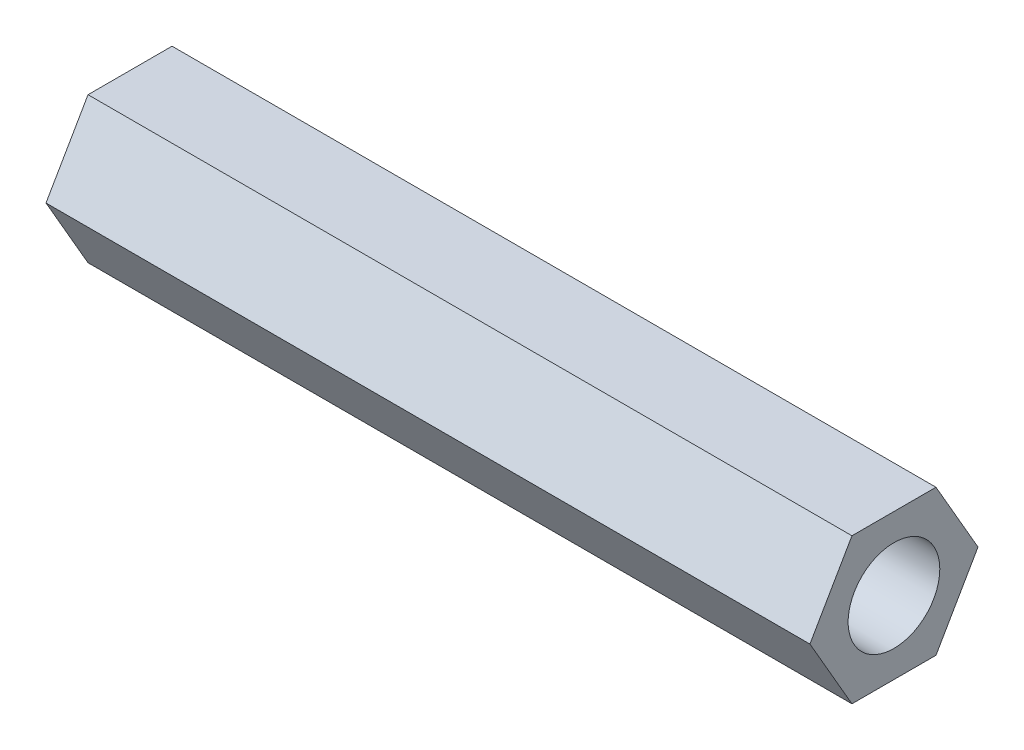
ISO-10303-21;
HEADER;
FILE_DESCRIPTION(('STEP AP214'),'2;1');
FILE_NAME('part.step','',(''),(''),'','','');
FILE_SCHEMA(('AUTOMOTIVE_DESIGN { 1 0 10303 214 1 1 1 1 }'));
ENDSEC;
DATA;
#1=APPLICATION_CONTEXT('core data for automotive mechanical design processes');
#2=APPLICATION_PROTOCOL_DEFINITION('international standard','automotive_design',2000,#1);
#3=PRODUCT_CONTEXT('',#1,'mechanical');
#4=PRODUCT('Part','Part','',(#3));
#5=PRODUCT_RELATED_PRODUCT_CATEGORY('part','',(#4));
#6=PRODUCT_DEFINITION_FORMATION('','',#4);
#7=PRODUCT_DEFINITION_CONTEXT('part definition',#1,'design');
#8=PRODUCT_DEFINITION('design','',#6,#7);
#9=PRODUCT_DEFINITION_SHAPE('','',#8);
#10=(LENGTH_UNIT() NAMED_UNIT(*) SI_UNIT(.MILLI.,.METRE.));
#11=(NAMED_UNIT(*) PLANE_ANGLE_UNIT() SI_UNIT($,.RADIAN.));
#12=(NAMED_UNIT(*) SI_UNIT($,.STERADIAN.) SOLID_ANGLE_UNIT());
#13=UNCERTAINTY_MEASURE_WITH_UNIT(LENGTH_MEASURE(1.E-05),#10,'distance_accuracy_value','');
#14=(GEOMETRIC_REPRESENTATION_CONTEXT(3) GLOBAL_UNCERTAINTY_ASSIGNED_CONTEXT((#13)) GLOBAL_UNIT_ASSIGNED_CONTEXT((#10,
#11,#12)) REPRESENTATION_CONTEXT('',''));
#15=CARTESIAN_POINT('',(0.,0.,0.));
#16=DIRECTION('',(0.,0.,1.));
#17=DIRECTION('',(1.,0.,0.));
#18=AXIS2_PLACEMENT_3D('',#15,#16,#17);
#19=CARTESIAN_POINT('',(25.,0.,0.));
#20=DIRECTION('',(1.,0.,0.));
#21=DIRECTION('',(0.,0.,-1.));
#22=AXIS2_PLACEMENT_3D('',#19,#20,#21);
#23=PLANE('',#22);
#24=DIRECTION('',(0.,0.866025403784438,-0.500000000000001));
#25=VECTOR('',#24,1.);
#26=CARTESIAN_POINT('',(25.,-2.38156986040721,-1.375));
#27=LINE('',#26,#25);
#28=CARTESIAN_POINT('',(25.,-2.38156986040721,-1.375));
#29=VERTEX_POINT('',#28);
#30=CARTESIAN_POINT('',(25.,0.,-2.75));
#31=VERTEX_POINT('',#30);
#32=EDGE_CURVE('E148',#29,#31,#27,.T.);
#33=ORIENTED_EDGE('',*,*,#32,.T.);
#34=DIRECTION('',(0.,0.866025403784438,0.5));
#35=VECTOR('',#34,1.);
#36=CARTESIAN_POINT('',(25.,0.,-2.75));
#37=LINE('',#36,#35);
#38=CARTESIAN_POINT('',(25.,2.38156986040722,-1.37499999999999));
#39=VERTEX_POINT('',#38);
#40=EDGE_CURVE('E96',#31,#39,#37,.T.);
#41=ORIENTED_EDGE('',*,*,#40,.T.);
#42=DIRECTION('',(0.,0.,1.));
#43=VECTOR('',#42,1.);
#44=CARTESIAN_POINT('',(25.,2.38156986040722,-1.37499999999999));
#45=LINE('',#44,#43);
#46=CARTESIAN_POINT('',(25.,2.38156986040722,1.375));
#47=VERTEX_POINT('',#46);
#48=EDGE_CURVE('E109',#39,#47,#45,.T.);
#49=ORIENTED_EDGE('',*,*,#48,.T.);
#50=DIRECTION('',(0.,-0.866025403784438,0.5));
#51=VECTOR('',#50,1.);
#52=CARTESIAN_POINT('',(25.,2.38156986040722,1.375));
#53=LINE('',#52,#51);
#54=CARTESIAN_POINT('',(25.,0.,2.75000000000001));
#55=VERTEX_POINT('',#54);
#56=EDGE_CURVE('E103',#47,#55,#53,.T.);
#57=ORIENTED_EDGE('',*,*,#56,.T.);
#58=DIRECTION('',(0.,-0.866025403784439,-0.499999999999999));
#59=VECTOR('',#58,1.);
#60=CARTESIAN_POINT('',(25.,0.,2.75000000000001));
#61=LINE('',#60,#59);
#62=CARTESIAN_POINT('',(25.,-2.38156986040721,1.37500000000001));
#63=VERTEX_POINT('',#62);
#64=EDGE_CURVE('E107',#55,#63,#61,.T.);
#65=ORIENTED_EDGE('',*,*,#64,.T.);
#66=DIRECTION('',(0.,0.,-1.));
#67=VECTOR('',#66,1.);
#68=CARTESIAN_POINT('',(25.,-2.38156986040721,1.37500000000001));
#69=LINE('',#68,#67);
#70=EDGE_CURVE('E59',#63,#29,#69,.T.);
#71=ORIENTED_EDGE('',*,*,#70,.T.);
#72=EDGE_LOOP('',(#33,#41,#49,#57,#65,#71));
#73=FACE_BOUND('',#72,.T.);
#74=CARTESIAN_POINT('',(25.,0.,0.));
#75=DIRECTION('',(1.,0.,0.));
#76=DIRECTION('',(0.,0.,-1.));
#77=AXIS2_PLACEMENT_3D('',#74,#75,#76);
#78=CIRCLE('',#77,1.5);
#79=CARTESIAN_POINT('',(25.,0.,-1.5));
#80=VERTEX_POINT('',#79);
#81=EDGE_CURVE('E136',#80,#80,#78,.T.);
#82=ORIENTED_EDGE('',*,*,#81,.F.);
#83=EDGE_LOOP('',(#82));
#84=FACE_BOUND('',#83,.T.);
#85=ADVANCED_FACE('F41',(#73,#84),#23,.T.);
#86=CARTESIAN_POINT('',(0.,0.,0.));
#87=DIRECTION('',(1.,0.,0.));
#88=DIRECTION('',(0.,0.,-1.));
#89=AXIS2_PLACEMENT_3D('',#86,#87,#88);
#90=PLANE('',#89);
#91=DIRECTION('',(0.,0.866025403784438,-0.500000000000001));
#92=VECTOR('',#91,1.);
#93=CARTESIAN_POINT('',(0.,-2.38156986040721,-1.375));
#94=LINE('',#93,#92);
#95=CARTESIAN_POINT('',(0.,-2.38156986040721,-1.375));
#96=VERTEX_POINT('',#95);
#97=CARTESIAN_POINT('',(0.,0.,-2.75));
#98=VERTEX_POINT('',#97);
#99=EDGE_CURVE('E131',#96,#98,#94,.T.);
#100=ORIENTED_EDGE('',*,*,#99,.F.);
#101=DIRECTION('',(0.,0.,-1.));
#102=VECTOR('',#101,1.);
#103=CARTESIAN_POINT('',(0.,-2.38156986040721,1.37500000000001));
#104=LINE('',#103,#102);
#105=CARTESIAN_POINT('',(0.,-2.38156986040721,1.37500000000001));
#106=VERTEX_POINT('',#105);
#107=EDGE_CURVE('E88',#106,#96,#104,.T.);
#108=ORIENTED_EDGE('',*,*,#107,.F.);
#109=DIRECTION('',(0.,-0.866025403784439,-0.499999999999999));
#110=VECTOR('',#109,1.);
#111=CARTESIAN_POINT('',(0.,0.,2.75000000000001));
#112=LINE('',#111,#110);
#113=CARTESIAN_POINT('',(0.,0.,2.75000000000001));
#114=VERTEX_POINT('',#113);
#115=EDGE_CURVE('E82',#114,#106,#112,.T.);
#116=ORIENTED_EDGE('',*,*,#115,.F.);
#117=DIRECTION('',(0.,-0.866025403784438,0.5));
#118=VECTOR('',#117,1.);
#119=CARTESIAN_POINT('',(0.,2.38156986040722,1.375));
#120=LINE('',#119,#118);
#121=CARTESIAN_POINT('',(0.,2.38156986040722,1.375));
#122=VERTEX_POINT('',#121);
#123=EDGE_CURVE('E118',#122,#114,#120,.T.);
#124=ORIENTED_EDGE('',*,*,#123,.F.);
#125=DIRECTION('',(0.,0.,1.));
#126=VECTOR('',#125,1.);
#127=CARTESIAN_POINT('',(0.,2.38156986040722,-1.37499999999999));
#128=LINE('',#127,#126);
#129=CARTESIAN_POINT('',(0.,2.38156986040722,-1.37499999999999));
#130=VERTEX_POINT('',#129);
#131=EDGE_CURVE('E139',#130,#122,#128,.T.);
#132=ORIENTED_EDGE('',*,*,#131,.F.);
#133=DIRECTION('',(0.,0.866025403784438,0.5));
#134=VECTOR('',#133,1.);
#135=CARTESIAN_POINT('',(0.,0.,-2.75));
#136=LINE('',#135,#134);
#137=EDGE_CURVE('E135',#98,#130,#136,.T.);
#138=ORIENTED_EDGE('',*,*,#137,.F.);
#139=EDGE_LOOP('',(#100,#108,#116,#124,#132,#138));
#140=FACE_BOUND('',#139,.T.);
#141=CARTESIAN_POINT('',(0.,0.,0.));
#142=DIRECTION('',(1.,0.,0.));
#143=DIRECTION('',(0.,0.,-1.));
#144=AXIS2_PLACEMENT_3D('',#141,#142,#143);
#145=CIRCLE('',#144,1.5);
#146=CARTESIAN_POINT('',(0.,0.,-1.5));
#147=VERTEX_POINT('',#146);
#148=EDGE_CURVE('E245',#147,#147,#145,.T.);
#149=ORIENTED_EDGE('',*,*,#148,.T.);
#150=EDGE_LOOP('',(#149));
#151=FACE_BOUND('',#150,.T.);
#152=ADVANCED_FACE('F161',(#140,#151),#90,.F.);
#153=CARTESIAN_POINT('',(25.,-2.38156986040721,-1.375));
#154=DIRECTION('',(0.,0.500000000000001,0.866025403784438));
#155=DIRECTION('',(0.,-0.866025403784438,0.500000000000001));
#156=AXIS2_PLACEMENT_3D('',#153,#154,#155);
#157=PLANE('',#156);
#158=ORIENTED_EDGE('',*,*,#99,.T.);
#159=DIRECTION('',(-1.,0.,0.));
#160=VECTOR('',#159,1.);
#161=CARTESIAN_POINT('',(25.,0.,-2.75));
#162=LINE('',#161,#160);
#163=EDGE_CURVE('E11',#31,#98,#162,.T.);
#164=ORIENTED_EDGE('',*,*,#163,.F.);
#165=ORIENTED_EDGE('',*,*,#32,.F.);
#166=DIRECTION('',(-1.,0.,0.));
#167=VECTOR('',#166,1.);
#168=CARTESIAN_POINT('',(25.,-2.38156986040721,-1.375));
#169=LINE('',#168,#167);
#170=EDGE_CURVE('E127',#29,#96,#169,.T.);
#171=ORIENTED_EDGE('',*,*,#170,.T.);
#172=EDGE_LOOP('',(#158,#164,#165,#171));
#173=FACE_BOUND('',#172,.T.);
#174=ADVANCED_FACE('F43',(#173),#157,.F.);
#175=CARTESIAN_POINT('',(25.,0.,-2.75));
#176=DIRECTION('',(0.,-0.5,0.866025403784438));
#177=DIRECTION('',(0.,-0.866025403784438,-0.5));
#178=AXIS2_PLACEMENT_3D('',#175,#176,#177);
#179=PLANE('',#178);
#180=ORIENTED_EDGE('',*,*,#137,.T.);
#181=DIRECTION('',(-1.,0.,0.));
#182=VECTOR('',#181,1.);
#183=CARTESIAN_POINT('',(25.,2.38156986040722,-1.37499999999999));
#184=LINE('',#183,#182);
#185=EDGE_CURVE('E51',#39,#130,#184,.T.);
#186=ORIENTED_EDGE('',*,*,#185,.F.);
#187=ORIENTED_EDGE('',*,*,#40,.F.);
#188=ORIENTED_EDGE('',*,*,#163,.T.);
#189=EDGE_LOOP('',(#180,#186,#187,#188));
#190=FACE_BOUND('',#189,.T.);
#191=ADVANCED_FACE('F186',(#190),#179,.F.);
#192=CARTESIAN_POINT('',(25.,2.38156986040722,-1.37499999999999));
#193=DIRECTION('',(0.,-1.,0.));
#194=DIRECTION('',(0.,0.,-1.));
#195=AXIS2_PLACEMENT_3D('',#192,#193,#194);
#196=PLANE('',#195);
#197=ORIENTED_EDGE('',*,*,#131,.T.);
#198=DIRECTION('',(-1.,0.,0.));
#199=VECTOR('',#198,1.);
#200=CARTESIAN_POINT('',(25.,2.38156986040722,1.375));
#201=LINE('',#200,#199);
#202=EDGE_CURVE('E120',#47,#122,#201,.T.);
#203=ORIENTED_EDGE('',*,*,#202,.F.);
#204=ORIENTED_EDGE('',*,*,#48,.F.);
#205=ORIENTED_EDGE('',*,*,#185,.T.);
#206=EDGE_LOOP('',(#197,#203,#204,#205));
#207=FACE_BOUND('',#206,.T.);
#208=ADVANCED_FACE('F158',(#207),#196,.F.);
#209=CARTESIAN_POINT('',(25.,2.38156986040722,1.375));
#210=DIRECTION('',(0.,-0.5,-0.866025403784438));
#211=DIRECTION('',(0.,0.866025403784439,-0.5));
#212=AXIS2_PLACEMENT_3D('',#209,#210,#211);
#213=PLANE('',#212);
#214=ORIENTED_EDGE('',*,*,#123,.T.);
#215=DIRECTION('',(-1.,0.,0.));
#216=VECTOR('',#215,1.);
#217=CARTESIAN_POINT('',(25.,0.,2.75000000000001));
#218=LINE('',#217,#216);
#219=EDGE_CURVE('E115',#55,#114,#218,.T.);
#220=ORIENTED_EDGE('',*,*,#219,.F.);
#221=ORIENTED_EDGE('',*,*,#56,.F.);
#222=ORIENTED_EDGE('',*,*,#202,.T.);
#223=EDGE_LOOP('',(#214,#220,#221,#222));
#224=FACE_BOUND('',#223,.T.);
#225=ADVANCED_FACE('F116',(#224),#213,.F.);
#226=CARTESIAN_POINT('',(25.,0.,2.75000000000001));
#227=DIRECTION('',(0.,0.499999999999999,-0.866025403784439));
#228=DIRECTION('',(0.,0.866025403784439,0.499999999999999));
#229=AXIS2_PLACEMENT_3D('',#226,#227,#228);
#230=PLANE('',#229);
#231=ORIENTED_EDGE('',*,*,#115,.T.);
#232=DIRECTION('',(-1.,0.,0.));
#233=VECTOR('',#232,1.);
#234=CARTESIAN_POINT('',(25.,-2.38156986040721,1.37500000000001));
#235=LINE('',#234,#233);
#236=EDGE_CURVE('E121',#63,#106,#235,.T.);
#237=ORIENTED_EDGE('',*,*,#236,.F.);
#238=ORIENTED_EDGE('',*,*,#64,.F.);
#239=ORIENTED_EDGE('',*,*,#219,.T.);
#240=EDGE_LOOP('',(#231,#237,#238,#239));
#241=FACE_BOUND('',#240,.T.);
#242=ADVANCED_FACE('F123',(#241),#230,.F.);
#243=CARTESIAN_POINT('',(25.,-2.38156986040721,1.37500000000001));
#244=DIRECTION('',(0.,1.,0.));
#245=DIRECTION('',(0.,0.,1.));
#246=AXIS2_PLACEMENT_3D('',#243,#244,#245);
#247=PLANE('',#246);
#248=ORIENTED_EDGE('',*,*,#107,.T.);
#249=ORIENTED_EDGE('',*,*,#170,.F.);
#250=ORIENTED_EDGE('',*,*,#70,.F.);
#251=ORIENTED_EDGE('',*,*,#236,.T.);
#252=EDGE_LOOP('',(#248,#249,#250,#251));
#253=FACE_BOUND('',#252,.T.);
#254=ADVANCED_FACE('F166',(#253),#247,.F.);
#255=CARTESIAN_POINT('',(25.,0.,0.));
#256=DIRECTION('',(-1.,0.,0.));
#257=DIRECTION('',(0.,0.,1.));
#258=AXIS2_PLACEMENT_3D('',#255,#256,#257);
#259=CYLINDRICAL_SURFACE('',#258,1.5);
#260=ORIENTED_EDGE('',*,*,#81,.T.);
#261=EDGE_LOOP('',(#260));
#262=FACE_BOUND('',#261,.T.);
#263=ORIENTED_EDGE('',*,*,#148,.F.);
#264=EDGE_LOOP('',(#263));
#265=FACE_BOUND('',#264,.T.);
#266=ADVANCED_FACE('F168',(#262,#265),#259,.F.);
#267=CLOSED_SHELL('',(#85,#152,#174,#191,#208,#225,#242,#254,#266));
#268=MANIFOLD_SOLID_BREP('B2',#267);
#269=ADVANCED_BREP_SHAPE_REPRESENTATION('',(#18,#268),#14);
#270=SHAPE_DEFINITION_REPRESENTATION(#9,#269);
ENDSEC;
END-ISO-10303-21;
